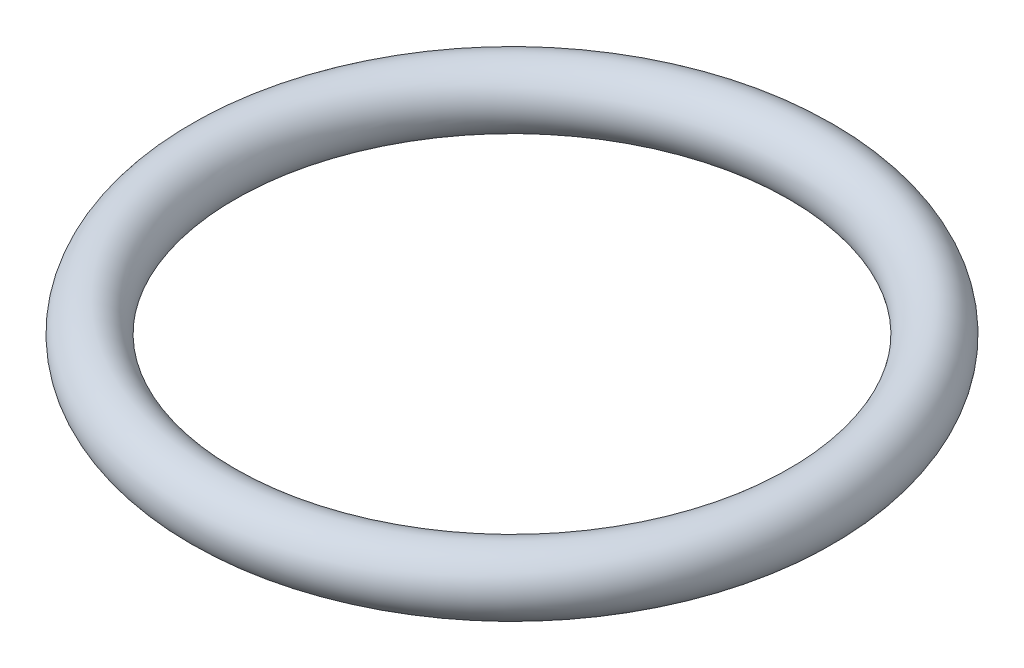
ISO-10303-21;
HEADER;
FILE_DESCRIPTION(('STEP AP214'),'2;1');
FILE_NAME('part.step','',(''),(''),'','','');
FILE_SCHEMA(('AUTOMOTIVE_DESIGN { 1 0 10303 214 1 1 1 1 }'));
ENDSEC;
DATA;
#1=APPLICATION_CONTEXT('core data for automotive mechanical design processes');
#2=APPLICATION_PROTOCOL_DEFINITION('international standard','automotive_design',2000,#1);
#3=PRODUCT_CONTEXT('',#1,'mechanical');
#4=PRODUCT('Part','Part','',(#3));
#5=PRODUCT_RELATED_PRODUCT_CATEGORY('part','',(#4));
#6=PRODUCT_DEFINITION_FORMATION('','',#4);
#7=PRODUCT_DEFINITION_CONTEXT('part definition',#1,'design');
#8=PRODUCT_DEFINITION('design','',#6,#7);
#9=PRODUCT_DEFINITION_SHAPE('','',#8);
#10=(LENGTH_UNIT() NAMED_UNIT(*) SI_UNIT(.MILLI.,.METRE.));
#11=(NAMED_UNIT(*) PLANE_ANGLE_UNIT() SI_UNIT($,.RADIAN.));
#12=(NAMED_UNIT(*) SI_UNIT($,.STERADIAN.) SOLID_ANGLE_UNIT());
#13=UNCERTAINTY_MEASURE_WITH_UNIT(LENGTH_MEASURE(1.E-05),#10,'distance_accuracy_value','');
#14=(GEOMETRIC_REPRESENTATION_CONTEXT(3) GLOBAL_UNCERTAINTY_ASSIGNED_CONTEXT((#13)) GLOBAL_UNIT_ASSIGNED_CONTEXT((#10,
#11,#12)) REPRESENTATION_CONTEXT('',''));
#15=CARTESIAN_POINT('',(0.,0.,0.));
#16=DIRECTION('',(0.,0.,1.));
#17=DIRECTION('',(1.,0.,0.));
#18=AXIS2_PLACEMENT_3D('',#15,#16,#17);
#19=CARTESIAN_POINT('',(0.,0.,0.));
#20=DIRECTION('',(0.,-1.,0.));
#21=DIRECTION('',(0.,0.,-1.));
#22=AXIS2_PLACEMENT_3D('',#19,#20,#21);
#23=TOROIDAL_SURFACE('',#22,4.85,0.500000000000001);
#24=CARTESIAN_POINT('',(0.,0.,-5.35));
#25=VERTEX_POINT('',#24);
#26=VERTEX_LOOP('',#25);
#27=FACE_BOUND('',#26,.T.);
#28=ADVANCED_FACE('F29',(#27),#23,.T.);
#29=CLOSED_SHELL('',(#28));
#30=MANIFOLD_SOLID_BREP('B2',#29);
#31=ADVANCED_BREP_SHAPE_REPRESENTATION('',(#18,#30),#14);
#32=SHAPE_DEFINITION_REPRESENTATION(#9,#31);
ENDSEC;
END-ISO-10303-21;
